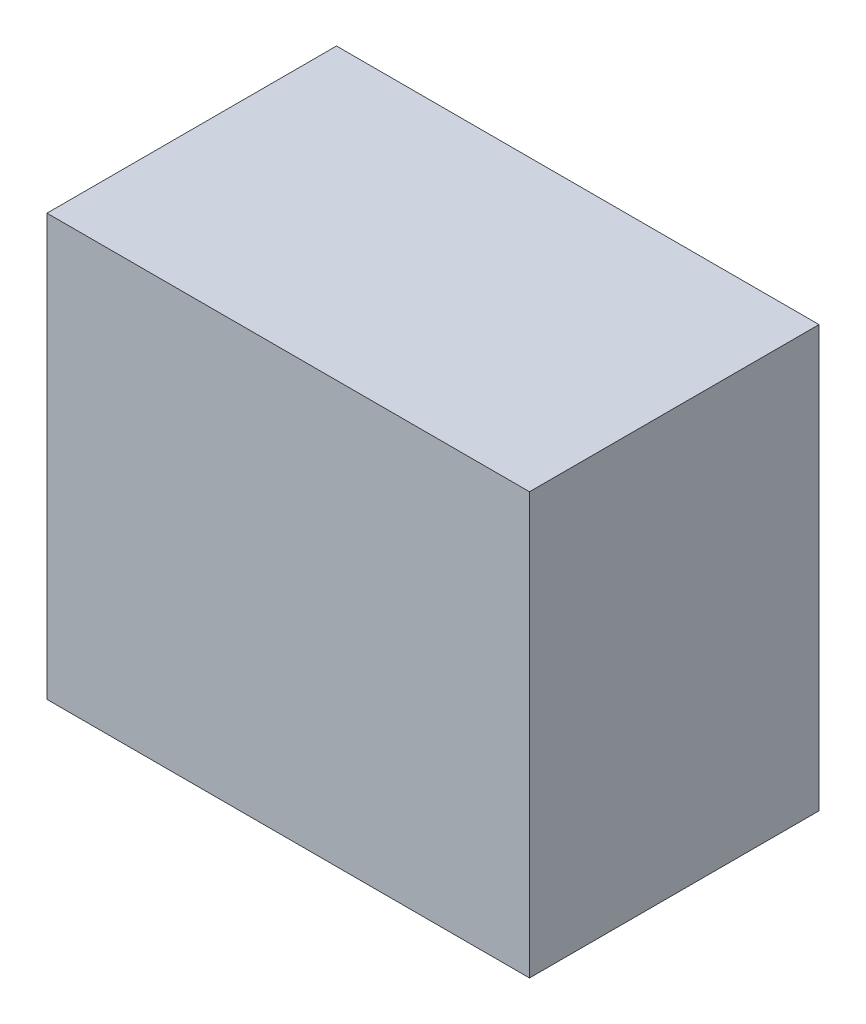
ISO-10303-21;
HEADER;
FILE_DESCRIPTION(('STEP AP214'),'2;1');
FILE_NAME('part.step','',(''),(''),'','','');
FILE_SCHEMA(('AUTOMOTIVE_DESIGN { 1 0 10303 214 1 1 1 1 }'));
ENDSEC;
DATA;
#1=APPLICATION_CONTEXT('core data for automotive mechanical design processes');
#2=APPLICATION_PROTOCOL_DEFINITION('international standard','automotive_design',2000,#1);
#3=PRODUCT_CONTEXT('',#1,'mechanical');
#4=PRODUCT('Part','Part','',(#3));
#5=PRODUCT_RELATED_PRODUCT_CATEGORY('part','',(#4));
#6=PRODUCT_DEFINITION_FORMATION('','',#4);
#7=PRODUCT_DEFINITION_CONTEXT('part definition',#1,'design');
#8=PRODUCT_DEFINITION('design','',#6,#7);
#9=PRODUCT_DEFINITION_SHAPE('','',#8);
#10=(LENGTH_UNIT() NAMED_UNIT(*) SI_UNIT(.MILLI.,.METRE.));
#11=(NAMED_UNIT(*) PLANE_ANGLE_UNIT() SI_UNIT($,.RADIAN.));
#12=(NAMED_UNIT(*) SI_UNIT($,.STERADIAN.) SOLID_ANGLE_UNIT());
#13=UNCERTAINTY_MEASURE_WITH_UNIT(LENGTH_MEASURE(1.E-05),#10,'distance_accuracy_value','');
#14=(GEOMETRIC_REPRESENTATION_CONTEXT(3) GLOBAL_UNCERTAINTY_ASSIGNED_CONTEXT((#13)) GLOBAL_UNIT_ASSIGNED_CONTEXT((#10,
#11,#12)) REPRESENTATION_CONTEXT('',''));
#15=CARTESIAN_POINT('',(0.,0.,0.));
#16=DIRECTION('',(0.,0.,1.));
#17=DIRECTION('',(1.,0.,0.));
#18=AXIS2_PLACEMENT_3D('',#15,#16,#17);
#19=CARTESIAN_POINT('',(27.5,48.,-16.5));
#20=DIRECTION('',(-1.,0.,0.));
#21=DIRECTION('',(0.,0.,1.));
#22=AXIS2_PLACEMENT_3D('',#19,#20,#21);
#23=PLANE('',#22);
#24=DIRECTION('',(0.,0.,-1.));
#25=VECTOR('',#24,1.);
#26=CARTESIAN_POINT('',(27.5,0.,-16.5));
#27=LINE('',#26,#25);
#28=CARTESIAN_POINT('',(27.5,0.,16.5));
#29=VERTEX_POINT('',#28);
#30=CARTESIAN_POINT('',(27.5,0.,-16.5));
#31=VERTEX_POINT('',#30);
#32=EDGE_CURVE('E172',#29,#31,#27,.T.);
#33=ORIENTED_EDGE('',*,*,#32,.T.);
#34=DIRECTION('',(0.,-1.,0.));
#35=VECTOR('',#34,1.);
#36=CARTESIAN_POINT('',(27.5,48.,-16.5));
#37=LINE('',#36,#35);
#38=CARTESIAN_POINT('',(27.5,48.,-16.5));
#39=VERTEX_POINT('',#38);
#40=EDGE_CURVE('E11',#39,#31,#37,.T.);
#41=ORIENTED_EDGE('',*,*,#40,.F.);
#42=DIRECTION('',(0.,0.,-1.));
#43=VECTOR('',#42,1.);
#44=CARTESIAN_POINT('',(27.5,48.,-16.5));
#45=LINE('',#44,#43);
#46=CARTESIAN_POINT('',(27.5,48.,16.5));
#47=VERTEX_POINT('',#46);
#48=EDGE_CURVE('E178',#47,#39,#45,.T.);
#49=ORIENTED_EDGE('',*,*,#48,.F.);
#50=DIRECTION('',(0.,-1.,0.));
#51=VECTOR('',#50,1.);
#52=CARTESIAN_POINT('',(27.5,48.,16.5));
#53=LINE('',#52,#51);
#54=EDGE_CURVE('E188',#47,#29,#53,.T.);
#55=ORIENTED_EDGE('',*,*,#54,.T.);
#56=EDGE_LOOP('',(#33,#41,#49,#55));
#57=FACE_BOUND('',#56,.T.);
#58=ADVANCED_FACE('F48',(#57),#23,.F.);
#59=CARTESIAN_POINT('',(-27.5,48.,-16.5));
#60=DIRECTION('',(0.,0.,1.));
#61=DIRECTION('',(1.,0.,0.));
#62=AXIS2_PLACEMENT_3D('',#59,#60,#61);
#63=PLANE('',#62);
#64=DIRECTION('',(-1.,0.,0.));
#65=VECTOR('',#64,1.);
#66=CARTESIAN_POINT('',(-27.5,0.,-16.5));
#67=LINE('',#66,#65);
#68=CARTESIAN_POINT('',(-27.5,0.,-16.5));
#69=VERTEX_POINT('',#68);
#70=EDGE_CURVE('E192',#31,#69,#67,.T.);
#71=ORIENTED_EDGE('',*,*,#70,.T.);
#72=DIRECTION('',(0.,-1.,0.));
#73=VECTOR('',#72,1.);
#74=CARTESIAN_POINT('',(-27.5,48.,-16.5));
#75=LINE('',#74,#73);
#76=CARTESIAN_POINT('',(-27.5,48.,-16.5));
#77=VERTEX_POINT('',#76);
#78=EDGE_CURVE('E57',#77,#69,#75,.T.);
#79=ORIENTED_EDGE('',*,*,#78,.F.);
#80=DIRECTION('',(-1.,0.,0.));
#81=VECTOR('',#80,1.);
#82=CARTESIAN_POINT('',(-27.5,48.,-16.5));
#83=LINE('',#82,#81);
#84=EDGE_CURVE('E96',#39,#77,#83,.T.);
#85=ORIENTED_EDGE('',*,*,#84,.F.);
#86=ORIENTED_EDGE('',*,*,#40,.T.);
#87=EDGE_LOOP('',(#71,#79,#85,#86));
#88=FACE_BOUND('',#87,.T.);
#89=ADVANCED_FACE('F221',(#88),#63,.F.);
#90=CARTESIAN_POINT('',(-27.5,48.,-16.5));
#91=DIRECTION('',(1.,0.,0.));
#92=DIRECTION('',(0.,0.,-1.));
#93=AXIS2_PLACEMENT_3D('',#90,#91,#92);
#94=PLANE('',#93);
#95=DIRECTION('',(0.,0.,1.));
#96=VECTOR('',#95,1.);
#97=CARTESIAN_POINT('',(-27.5,0.,-16.5));
#98=LINE('',#97,#96);
#99=CARTESIAN_POINT('',(-27.5,0.,16.5));
#100=VERTEX_POINT('',#99);
#101=EDGE_CURVE('E83',#69,#100,#98,.T.);
#102=ORIENTED_EDGE('',*,*,#101,.T.);
#103=DIRECTION('',(0.,-1.,0.));
#104=VECTOR('',#103,1.);
#105=CARTESIAN_POINT('',(-27.5,48.,16.5));
#106=LINE('',#105,#104);
#107=CARTESIAN_POINT('',(-27.5,48.,16.5));
#108=VERTEX_POINT('',#107);
#109=EDGE_CURVE('E201',#108,#100,#106,.T.);
#110=ORIENTED_EDGE('',*,*,#109,.F.);
#111=DIRECTION('',(0.,0.,1.));
#112=VECTOR('',#111,1.);
#113=CARTESIAN_POINT('',(-27.5,48.,-16.5));
#114=LINE('',#113,#112);
#115=EDGE_CURVE('E183',#77,#108,#114,.T.);
#116=ORIENTED_EDGE('',*,*,#115,.F.);
#117=ORIENTED_EDGE('',*,*,#78,.T.);
#118=EDGE_LOOP('',(#102,#110,#116,#117));
#119=FACE_BOUND('',#118,.T.);
#120=ADVANCED_FACE('F205',(#119),#94,.F.);
#121=CARTESIAN_POINT('',(-27.5,48.,16.5));
#122=DIRECTION('',(0.,0.,-1.));
#123=DIRECTION('',(-1.,0.,0.));
#124=AXIS2_PLACEMENT_3D('',#121,#122,#123);
#125=PLANE('',#124);
#126=DIRECTION('',(1.,0.,0.));
#127=VECTOR('',#126,1.);
#128=CARTESIAN_POINT('',(-27.5,0.,16.5));
#129=LINE('',#128,#127);
#130=EDGE_CURVE('E89',#100,#29,#129,.T.);
#131=ORIENTED_EDGE('',*,*,#130,.T.);
#132=ORIENTED_EDGE('',*,*,#54,.F.);
#133=DIRECTION('',(1.,0.,0.));
#134=VECTOR('',#133,1.);
#135=CARTESIAN_POINT('',(-27.5,48.,16.5));
#136=LINE('',#135,#134);
#137=EDGE_CURVE('E65',#108,#47,#136,.T.);
#138=ORIENTED_EDGE('',*,*,#137,.F.);
#139=ORIENTED_EDGE('',*,*,#109,.T.);
#140=EDGE_LOOP('',(#131,#132,#138,#139));
#141=FACE_BOUND('',#140,.T.);
#142=ADVANCED_FACE('F212',(#141),#125,.F.);
#143=CARTESIAN_POINT('',(0.,48.,0.));
#144=DIRECTION('',(0.,1.,0.));
#145=DIRECTION('',(0.,0.,1.));
#146=AXIS2_PLACEMENT_3D('',#143,#144,#145);
#147=PLANE('',#146);
#148=ORIENTED_EDGE('',*,*,#48,.T.);
#149=ORIENTED_EDGE('',*,*,#84,.T.);
#150=ORIENTED_EDGE('',*,*,#115,.T.);
#151=ORIENTED_EDGE('',*,*,#137,.T.);
#152=EDGE_LOOP('',(#148,#149,#150,#151));
#153=FACE_BOUND('',#152,.T.);
#154=ADVANCED_FACE('F214',(#153),#147,.T.);
#155=CARTESIAN_POINT('',(0.,0.,0.));
#156=DIRECTION('',(0.,1.,0.));
#157=DIRECTION('',(0.,0.,1.));
#158=AXIS2_PLACEMENT_3D('',#155,#156,#157);
#159=PLANE('',#158);
#160=ORIENTED_EDGE('',*,*,#32,.F.);
#161=ORIENTED_EDGE('',*,*,#130,.F.);
#162=ORIENTED_EDGE('',*,*,#101,.F.);
#163=ORIENTED_EDGE('',*,*,#70,.F.);
#164=EDGE_LOOP('',(#160,#161,#162,#163));
#165=FACE_BOUND('',#164,.T.);
#166=ADVANCED_FACE('F208',(#165),#159,.F.);
#167=CLOSED_SHELL('',(#58,#89,#120,#142,#154,#166));
#168=CARTESIAN_POINT('',(25.75,32.,0.));
#169=DIRECTION('',(-1.,0.,0.));
#170=DIRECTION('',(0.,0.,1.));
#171=AXIS2_PLACEMENT_3D('',#168,#169,#170);
#172=CYLINDRICAL_SURFACE('',#171,14.75565);
#173=CARTESIAN_POINT('',(-25.75,32.,0.));
#174=DIRECTION('',(-1.,0.,0.));
#175=DIRECTION('',(0.,0.,1.));
#176=AXIS2_PLACEMENT_3D('',#173,#174,#175);
#177=CIRCLE('',#176,14.75565);
#178=CARTESIAN_POINT('',(-25.75,32.,14.75565));
#179=VERTEX_POINT('',#178);
#180=CARTESIAN_POINT('',(-25.75,32.,-14.75565));
#181=VERTEX_POINT('',#180);
#182=EDGE_CURVE('E130',#179,#181,#177,.T.);
#183=ORIENTED_EDGE('',*,*,#182,.T.);
#184=DIRECTION('',(-1.,0.,0.));
#185=VECTOR('',#184,1.);
#186=CARTESIAN_POINT('',(25.75,32.,-14.75565));
#187=LINE('',#186,#185);
#188=CARTESIAN_POINT('',(25.75,32.,-14.75565));
#189=VERTEX_POINT('',#188);
#190=EDGE_CURVE('E123',#189,#181,#187,.T.);
#191=ORIENTED_EDGE('',*,*,#190,.F.);
#192=CARTESIAN_POINT('',(25.75,32.,0.));
#193=DIRECTION('',(-1.,0.,0.));
#194=DIRECTION('',(0.,0.,1.));
#195=AXIS2_PLACEMENT_3D('',#192,#193,#194);
#196=CIRCLE('',#195,14.75565);
#197=CARTESIAN_POINT('',(25.75,32.,14.75565));
#198=VERTEX_POINT('',#197);
#199=EDGE_CURVE('E127',#198,#189,#196,.T.);
#200=ORIENTED_EDGE('',*,*,#199,.F.);
#201=DIRECTION('',(-1.,0.,0.));
#202=VECTOR('',#201,1.);
#203=CARTESIAN_POINT('',(25.75,32.,14.75565));
#204=LINE('',#203,#202);
#205=EDGE_CURVE('E169',#198,#179,#204,.T.);
#206=ORIENTED_EDGE('',*,*,#205,.T.);
#207=EDGE_LOOP('',(#183,#191,#200,#206));
#208=FACE_BOUND('',#207,.T.);
#209=ADVANCED_FACE('F125',(#208),#172,.F.);
#210=CARTESIAN_POINT('',(25.75,32.,14.75565));
#211=DIRECTION('',(0.,0.,1.));
#212=DIRECTION('',(0.,-1.,0.));
#213=AXIS2_PLACEMENT_3D('',#210,#211,#212);
#214=PLANE('',#213);
#215=DIRECTION('',(0.,1.,0.));
#216=VECTOR('',#215,1.);
#217=CARTESIAN_POINT('',(-25.75,32.,14.75565));
#218=LINE('',#217,#216);
#219=CARTESIAN_POINT('',(-25.75,16.,14.75565));
#220=VERTEX_POINT('',#219);
#221=EDGE_CURVE('E150',#220,#179,#218,.T.);
#222=ORIENTED_EDGE('',*,*,#221,.T.);
#223=ORIENTED_EDGE('',*,*,#205,.F.);
#224=DIRECTION('',(0.,1.,0.));
#225=VECTOR('',#224,1.);
#226=CARTESIAN_POINT('',(25.75,32.,14.75565));
#227=LINE('',#226,#225);
#228=CARTESIAN_POINT('',(25.75,16.,14.75565));
#229=VERTEX_POINT('',#228);
#230=EDGE_CURVE('E136',#229,#198,#227,.T.);
#231=ORIENTED_EDGE('',*,*,#230,.F.);
#232=DIRECTION('',(-1.,0.,0.));
#233=VECTOR('',#232,1.);
#234=CARTESIAN_POINT('',(25.75,16.,14.75565));
#235=LINE('',#234,#233);
#236=EDGE_CURVE('E173',#229,#220,#235,.T.);
#237=ORIENTED_EDGE('',*,*,#236,.T.);
#238=EDGE_LOOP('',(#222,#223,#231,#237));
#239=FACE_BOUND('',#238,.T.);
#240=ADVANCED_FACE('F260',(#239),#214,.F.);
#241=CARTESIAN_POINT('',(25.75,16.,0.));
#242=DIRECTION('',(-1.,0.,0.));
#243=DIRECTION('',(0.,0.,1.));
#244=AXIS2_PLACEMENT_3D('',#241,#242,#243);
#245=CYLINDRICAL_SURFACE('',#244,14.75565);
#246=CARTESIAN_POINT('',(-25.75,16.,0.));
#247=DIRECTION('',(-1.,0.,0.));
#248=DIRECTION('',(0.,0.,1.));
#249=AXIS2_PLACEMENT_3D('',#246,#247,#248);
#250=CIRCLE('',#249,14.75565);
#251=CARTESIAN_POINT('',(-25.75,16.,-14.75565));
#252=VERTEX_POINT('',#251);
#253=EDGE_CURVE('E154',#252,#220,#250,.T.);
#254=ORIENTED_EDGE('',*,*,#253,.T.);
#255=ORIENTED_EDGE('',*,*,#236,.F.);
#256=CARTESIAN_POINT('',(25.75,16.,0.));
#257=DIRECTION('',(-1.,0.,0.));
#258=DIRECTION('',(0.,0.,1.));
#259=AXIS2_PLACEMENT_3D('',#256,#257,#258);
#260=CIRCLE('',#259,14.75565);
#261=CARTESIAN_POINT('',(25.75,16.,-14.75565));
#262=VERTEX_POINT('',#261);
#263=EDGE_CURVE('E145',#262,#229,#260,.T.);
#264=ORIENTED_EDGE('',*,*,#263,.F.);
#265=DIRECTION('',(-1.,0.,0.));
#266=VECTOR('',#265,1.);
#267=CARTESIAN_POINT('',(25.75,16.,-14.75565));
#268=LINE('',#267,#266);
#269=EDGE_CURVE('E135',#262,#252,#268,.T.);
#270=ORIENTED_EDGE('',*,*,#269,.T.);
#271=EDGE_LOOP('',(#254,#255,#264,#270));
#272=FACE_BOUND('',#271,.T.);
#273=ADVANCED_FACE('F269',(#272),#245,.F.);
#274=CARTESIAN_POINT('',(25.75,32.,-14.75565));
#275=DIRECTION('',(0.,0.,-1.));
#276=DIRECTION('',(0.,1.,0.));
#277=AXIS2_PLACEMENT_3D('',#274,#275,#276);
#278=PLANE('',#277);
#279=DIRECTION('',(0.,-1.,0.));
#280=VECTOR('',#279,1.);
#281=CARTESIAN_POINT('',(-25.75,32.,-14.75565));
#282=LINE('',#281,#280);
#283=EDGE_CURVE('E163',#181,#252,#282,.T.);
#284=ORIENTED_EDGE('',*,*,#283,.T.);
#285=ORIENTED_EDGE('',*,*,#269,.F.);
#286=DIRECTION('',(0.,-1.,0.));
#287=VECTOR('',#286,1.);
#288=CARTESIAN_POINT('',(25.75,32.,-14.75565));
#289=LINE('',#288,#287);
#290=EDGE_CURVE('E139',#189,#262,#289,.T.);
#291=ORIENTED_EDGE('',*,*,#290,.F.);
#292=ORIENTED_EDGE('',*,*,#190,.T.);
#293=EDGE_LOOP('',(#284,#285,#291,#292));
#294=FACE_BOUND('',#293,.T.);
#295=ADVANCED_FACE('F140',(#294),#278,.F.);
#296=CARTESIAN_POINT('',(25.75,32.,0.));
#297=DIRECTION('',(-1.,0.,0.));
#298=DIRECTION('',(0.,0.,1.));
#299=AXIS2_PLACEMENT_3D('',#296,#297,#298);
#300=PLANE('',#299);
#301=ORIENTED_EDGE('',*,*,#199,.T.);
#302=ORIENTED_EDGE('',*,*,#290,.T.);
#303=ORIENTED_EDGE('',*,*,#263,.T.);
#304=ORIENTED_EDGE('',*,*,#230,.T.);
#305=EDGE_LOOP('',(#301,#302,#303,#304));
#306=FACE_BOUND('',#305,.T.);
#307=ADVANCED_FACE('F147',(#306),#300,.T.);
#308=CARTESIAN_POINT('',(-25.75,32.,0.));
#309=DIRECTION('',(-1.,0.,0.));
#310=DIRECTION('',(0.,0.,1.));
#311=AXIS2_PLACEMENT_3D('',#308,#309,#310);
#312=PLANE('',#311);
#313=ORIENTED_EDGE('',*,*,#182,.F.);
#314=ORIENTED_EDGE('',*,*,#221,.F.);
#315=ORIENTED_EDGE('',*,*,#253,.F.);
#316=ORIENTED_EDGE('',*,*,#283,.F.);
#317=EDGE_LOOP('',(#313,#314,#315,#316));
#318=FACE_BOUND('',#317,.T.);
#319=ADVANCED_FACE('F293',(#318),#312,.F.);
#320=CLOSED_SHELL('',(#209,#240,#273,#295,#307,#319));
#321=ORIENTED_CLOSED_SHELL('',*,#320,.T.);
#322=BREP_WITH_VOIDS('B2',#167,(#321));
#323=ADVANCED_BREP_SHAPE_REPRESENTATION('',(#18,#322),#14);
#324=SHAPE_DEFINITION_REPRESENTATION(#9,#323);
ENDSEC;
END-ISO-10303-21;
